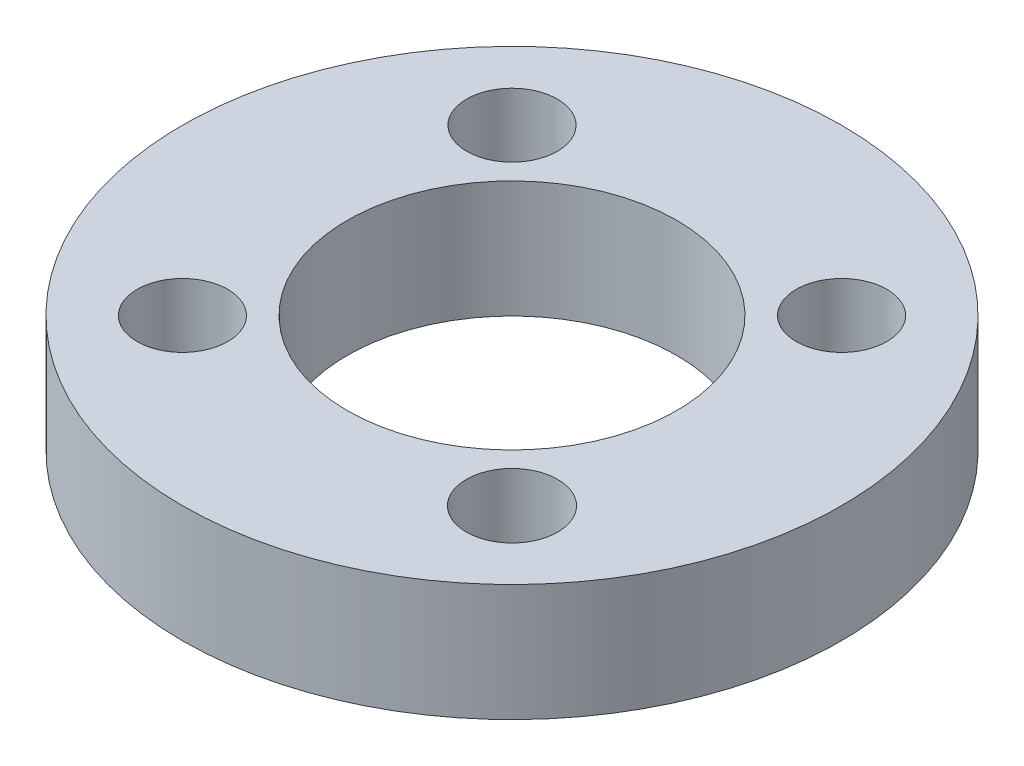
ISO-10303-21;
HEADER;
FILE_DESCRIPTION(('STEP AP214'),'2;1');
FILE_NAME('part.step','',(''),(''),'','','');
FILE_SCHEMA(('AUTOMOTIVE_DESIGN { 1 0 10303 214 1 1 1 1 }'));
ENDSEC;
DATA;
#1=APPLICATION_CONTEXT('core data for automotive mechanical design processes');
#2=APPLICATION_PROTOCOL_DEFINITION('international standard','automotive_design',2000,#1);
#3=PRODUCT_CONTEXT('',#1,'mechanical');
#4=PRODUCT('Part','Part','',(#3));
#5=PRODUCT_RELATED_PRODUCT_CATEGORY('part','',(#4));
#6=PRODUCT_DEFINITION_FORMATION('','',#4);
#7=PRODUCT_DEFINITION_CONTEXT('part definition',#1,'design');
#8=PRODUCT_DEFINITION('design','',#6,#7);
#9=PRODUCT_DEFINITION_SHAPE('','',#8);
#10=(LENGTH_UNIT() NAMED_UNIT(*) SI_UNIT(.MILLI.,.METRE.));
#11=(NAMED_UNIT(*) PLANE_ANGLE_UNIT() SI_UNIT($,.RADIAN.));
#12=(NAMED_UNIT(*) SI_UNIT($,.STERADIAN.) SOLID_ANGLE_UNIT());
#13=UNCERTAINTY_MEASURE_WITH_UNIT(LENGTH_MEASURE(1.E-05),#10,'distance_accuracy_value','');
#14=(GEOMETRIC_REPRESENTATION_CONTEXT(3) GLOBAL_UNCERTAINTY_ASSIGNED_CONTEXT((#13)) GLOBAL_UNIT_ASSIGNED_CONTEXT((#10,
#11,#12)) REPRESENTATION_CONTEXT('',''));
#15=CARTESIAN_POINT('',(0.,0.,0.));
#16=DIRECTION('',(0.,0.,1.));
#17=DIRECTION('',(1.,0.,0.));
#18=AXIS2_PLACEMENT_3D('',#15,#16,#17);
#19=CARTESIAN_POINT('',(0.,3.55,0.));
#20=DIRECTION('',(0.,1.,0.));
#21=DIRECTION('',(0.,0.,1.));
#22=AXIS2_PLACEMENT_3D('',#19,#20,#21);
#23=PLANE('',#22);
#24=CARTESIAN_POINT('',(5.,3.55,-5.00000000000002));
#25=DIRECTION('',(0.,1.,0.));
#26=DIRECTION('',(0.,0.,1.));
#27=AXIS2_PLACEMENT_3D('',#24,#25,#26);
#28=CIRCLE('',#27,1.375);
#29=CARTESIAN_POINT('',(5.,3.55,-3.62500000000002));
#30=VERTEX_POINT('',#29);
#31=EDGE_CURVE('E60',#30,#30,#28,.T.);
#32=ORIENTED_EDGE('',*,*,#31,.F.);
#33=EDGE_LOOP('',(#32));
#34=FACE_BOUND('',#33,.T.);
#35=CARTESIAN_POINT('',(-5.,3.55,5.00000000000002));
#36=DIRECTION('',(0.,1.,0.));
#37=DIRECTION('',(0.,0.,1.));
#38=AXIS2_PLACEMENT_3D('',#35,#36,#37);
#39=CIRCLE('',#38,1.375);
#40=CARTESIAN_POINT('',(-5.,3.55,6.37500000000002));
#41=VERTEX_POINT('',#40);
#42=EDGE_CURVE('E48',#41,#41,#39,.T.);
#43=ORIENTED_EDGE('',*,*,#42,.F.);
#44=EDGE_LOOP('',(#43));
#45=FACE_BOUND('',#44,.T.);
#46=CARTESIAN_POINT('',(0.,3.55,0.));
#47=DIRECTION('',(0.,1.,0.));
#48=DIRECTION('',(0.,0.,1.));
#49=AXIS2_PLACEMENT_3D('',#46,#47,#48);
#50=CIRCLE('',#49,10.);
#51=CARTESIAN_POINT('',(0.,3.55,10.));
#52=VERTEX_POINT('',#51);
#53=EDGE_CURVE('E10',#52,#52,#50,.T.);
#54=ORIENTED_EDGE('',*,*,#53,.T.);
#55=EDGE_LOOP('',(#54));
#56=FACE_BOUND('',#55,.T.);
#57=CARTESIAN_POINT('',(0.,3.55,0.));
#58=DIRECTION('',(0.,1.,0.));
#59=DIRECTION('',(0.,0.,1.));
#60=AXIS2_PLACEMENT_3D('',#57,#58,#59);
#61=CIRCLE('',#60,5.);
#62=CARTESIAN_POINT('',(0.,3.55,5.));
#63=VERTEX_POINT('',#62);
#64=EDGE_CURVE('E43',#63,#63,#61,.T.);
#65=ORIENTED_EDGE('',*,*,#64,.F.);
#66=EDGE_LOOP('',(#65));
#67=FACE_BOUND('',#66,.T.);
#68=CARTESIAN_POINT('',(5.,3.55,5.00000000000002));
#69=DIRECTION('',(0.,1.,0.));
#70=DIRECTION('',(0.,0.,1.));
#71=AXIS2_PLACEMENT_3D('',#68,#69,#70);
#72=CIRCLE('',#71,1.38637674729393);
#73=CARTESIAN_POINT('',(5.,3.55,6.38637674729394));
#74=VERTEX_POINT('',#73);
#75=EDGE_CURVE('E54',#74,#74,#72,.T.);
#76=ORIENTED_EDGE('',*,*,#75,.F.);
#77=EDGE_LOOP('',(#76));
#78=FACE_BOUND('',#77,.T.);
#79=CARTESIAN_POINT('',(-5.,3.55,-5.00000000000002));
#80=DIRECTION('',(0.,1.,0.));
#81=DIRECTION('',(0.,0.,1.));
#82=AXIS2_PLACEMENT_3D('',#79,#80,#81);
#83=CIRCLE('',#82,1.375);
#84=CARTESIAN_POINT('',(-5.,3.55,-3.62500000000002));
#85=VERTEX_POINT('',#84);
#86=EDGE_CURVE('E66',#85,#85,#83,.T.);
#87=ORIENTED_EDGE('',*,*,#86,.F.);
#88=EDGE_LOOP('',(#87));
#89=FACE_BOUND('',#88,.T.);
#90=ADVANCED_FACE('F32',(#34,#45,#56,#67,#78,#89),#23,.T.);
#91=CARTESIAN_POINT('',(0.,0.,0.));
#92=DIRECTION('',(0.,1.,0.));
#93=DIRECTION('',(0.,0.,1.));
#94=AXIS2_PLACEMENT_3D('',#91,#92,#93);
#95=PLANE('',#94);
#96=CARTESIAN_POINT('',(0.,0.,0.));
#97=DIRECTION('',(0.,1.,0.));
#98=DIRECTION('',(0.,0.,1.));
#99=AXIS2_PLACEMENT_3D('',#96,#97,#98);
#100=CIRCLE('',#99,10.);
#101=CARTESIAN_POINT('',(0.,0.,10.));
#102=VERTEX_POINT('',#101);
#103=EDGE_CURVE('E36',#102,#102,#100,.T.);
#104=ORIENTED_EDGE('',*,*,#103,.F.);
#105=EDGE_LOOP('',(#104));
#106=FACE_BOUND('',#105,.T.);
#107=CARTESIAN_POINT('',(0.,0.,0.));
#108=DIRECTION('',(0.,1.,0.));
#109=DIRECTION('',(0.,0.,1.));
#110=AXIS2_PLACEMENT_3D('',#107,#108,#109);
#111=CIRCLE('',#110,5.);
#112=CARTESIAN_POINT('',(0.,0.,5.));
#113=VERTEX_POINT('',#112);
#114=EDGE_CURVE('E45',#113,#113,#111,.T.);
#115=ORIENTED_EDGE('',*,*,#114,.T.);
#116=EDGE_LOOP('',(#115));
#117=FACE_BOUND('',#116,.T.);
#118=CARTESIAN_POINT('',(-5.,0.,5.00000000000002));
#119=DIRECTION('',(0.,1.,0.));
#120=DIRECTION('',(0.,0.,1.));
#121=AXIS2_PLACEMENT_3D('',#118,#119,#120);
#122=CIRCLE('',#121,1.375);
#123=CARTESIAN_POINT('',(-5.,0.,6.37500000000002));
#124=VERTEX_POINT('',#123);
#125=EDGE_CURVE('E51',#124,#124,#122,.T.);
#126=ORIENTED_EDGE('',*,*,#125,.T.);
#127=EDGE_LOOP('',(#126));
#128=FACE_BOUND('',#127,.T.);
#129=CARTESIAN_POINT('',(5.,0.,5.00000000000002));
#130=DIRECTION('',(0.,1.,0.));
#131=DIRECTION('',(0.,0.,1.));
#132=AXIS2_PLACEMENT_3D('',#129,#130,#131);
#133=CIRCLE('',#132,1.38637674729393);
#134=CARTESIAN_POINT('',(5.,0.,6.38637674729394));
#135=VERTEX_POINT('',#134);
#136=EDGE_CURVE('E57',#135,#135,#133,.T.);
#137=ORIENTED_EDGE('',*,*,#136,.T.);
#138=EDGE_LOOP('',(#137));
#139=FACE_BOUND('',#138,.T.);
#140=CARTESIAN_POINT('',(5.,0.,-5.00000000000002));
#141=DIRECTION('',(0.,1.,0.));
#142=DIRECTION('',(0.,0.,1.));
#143=AXIS2_PLACEMENT_3D('',#140,#141,#142);
#144=CIRCLE('',#143,1.375);
#145=CARTESIAN_POINT('',(5.,0.,-3.62500000000002));
#146=VERTEX_POINT('',#145);
#147=EDGE_CURVE('E63',#146,#146,#144,.T.);
#148=ORIENTED_EDGE('',*,*,#147,.T.);
#149=EDGE_LOOP('',(#148));
#150=FACE_BOUND('',#149,.T.);
#151=CARTESIAN_POINT('',(-5.,0.,-5.00000000000002));
#152=DIRECTION('',(0.,1.,0.));
#153=DIRECTION('',(0.,0.,1.));
#154=AXIS2_PLACEMENT_3D('',#151,#152,#153);
#155=CIRCLE('',#154,1.375);
#156=CARTESIAN_POINT('',(-5.,0.,-3.62500000000002));
#157=VERTEX_POINT('',#156);
#158=EDGE_CURVE('E69',#157,#157,#155,.T.);
#159=ORIENTED_EDGE('',*,*,#158,.T.);
#160=EDGE_LOOP('',(#159));
#161=FACE_BOUND('',#160,.T.);
#162=ADVANCED_FACE('F79',(#106,#117,#128,#139,#150,#161),#95,.F.);
#163=CARTESIAN_POINT('',(0.,3.55,0.));
#164=DIRECTION('',(0.,-1.,0.));
#165=DIRECTION('',(0.,0.,-1.));
#166=AXIS2_PLACEMENT_3D('',#163,#164,#165);
#167=CYLINDRICAL_SURFACE('',#166,10.);
#168=ORIENTED_EDGE('',*,*,#53,.F.);
#169=EDGE_LOOP('',(#168));
#170=FACE_BOUND('',#169,.T.);
#171=ORIENTED_EDGE('',*,*,#103,.T.);
#172=EDGE_LOOP('',(#171));
#173=FACE_BOUND('',#172,.T.);
#174=ADVANCED_FACE('F34',(#170,#173),#167,.T.);
#175=CARTESIAN_POINT('',(0.,3.55,0.));
#176=DIRECTION('',(0.,-1.,0.));
#177=DIRECTION('',(0.,0.,-1.));
#178=AXIS2_PLACEMENT_3D('',#175,#176,#177);
#179=CYLINDRICAL_SURFACE('',#178,5.);
#180=ORIENTED_EDGE('',*,*,#64,.T.);
#181=EDGE_LOOP('',(#180));
#182=FACE_BOUND('',#181,.T.);
#183=ORIENTED_EDGE('',*,*,#114,.F.);
#184=EDGE_LOOP('',(#183));
#185=FACE_BOUND('',#184,.T.);
#186=ADVANCED_FACE('F89',(#182,#185),#179,.F.);
#187=CARTESIAN_POINT('',(-5.,3.55,5.00000000000002));
#188=DIRECTION('',(0.,-1.,0.));
#189=DIRECTION('',(0.,0.,-1.));
#190=AXIS2_PLACEMENT_3D('',#187,#188,#189);
#191=CYLINDRICAL_SURFACE('',#190,1.375);
#192=ORIENTED_EDGE('',*,*,#42,.T.);
#193=EDGE_LOOP('',(#192));
#194=FACE_BOUND('',#193,.T.);
#195=ORIENTED_EDGE('',*,*,#125,.F.);
#196=EDGE_LOOP('',(#195));
#197=FACE_BOUND('',#196,.T.);
#198=ADVANCED_FACE('F92',(#194,#197),#191,.F.);
#199=CARTESIAN_POINT('',(5.,3.55,5.00000000000002));
#200=DIRECTION('',(0.,-1.,0.));
#201=DIRECTION('',(0.,0.,-1.));
#202=AXIS2_PLACEMENT_3D('',#199,#200,#201);
#203=CYLINDRICAL_SURFACE('',#202,1.38637674729393);
#204=ORIENTED_EDGE('',*,*,#75,.T.);
#205=EDGE_LOOP('',(#204));
#206=FACE_BOUND('',#205,.T.);
#207=ORIENTED_EDGE('',*,*,#136,.F.);
#208=EDGE_LOOP('',(#207));
#209=FACE_BOUND('',#208,.T.);
#210=ADVANCED_FACE('F96',(#206,#209),#203,.F.);
#211=CARTESIAN_POINT('',(5.,3.55,-5.00000000000002));
#212=DIRECTION('',(0.,-1.,0.));
#213=DIRECTION('',(0.,0.,-1.));
#214=AXIS2_PLACEMENT_3D('',#211,#212,#213);
#215=CYLINDRICAL_SURFACE('',#214,1.375);
#216=ORIENTED_EDGE('',*,*,#31,.T.);
#217=EDGE_LOOP('',(#216));
#218=FACE_BOUND('',#217,.T.);
#219=ORIENTED_EDGE('',*,*,#147,.F.);
#220=EDGE_LOOP('',(#219));
#221=FACE_BOUND('',#220,.T.);
#222=ADVANCED_FACE('F100',(#218,#221),#215,.F.);
#223=CARTESIAN_POINT('',(-5.,3.55,-5.00000000000002));
#224=DIRECTION('',(0.,-1.,0.));
#225=DIRECTION('',(0.,0.,-1.));
#226=AXIS2_PLACEMENT_3D('',#223,#224,#225);
#227=CYLINDRICAL_SURFACE('',#226,1.375);
#228=ORIENTED_EDGE('',*,*,#86,.T.);
#229=EDGE_LOOP('',(#228));
#230=FACE_BOUND('',#229,.T.);
#231=ORIENTED_EDGE('',*,*,#158,.F.);
#232=EDGE_LOOP('',(#231));
#233=FACE_BOUND('',#232,.T.);
#234=ADVANCED_FACE('F75',(#230,#233),#227,.F.);
#235=CLOSED_SHELL('',(#90,#162,#174,#186,#198,#210,#222,#234));
#236=MANIFOLD_SOLID_BREP('B2',#235);
#237=ADVANCED_BREP_SHAPE_REPRESENTATION('',(#18,#236),#14);
#238=SHAPE_DEFINITION_REPRESENTATION(#9,#237);
ENDSEC;
END-ISO-10303-21;
